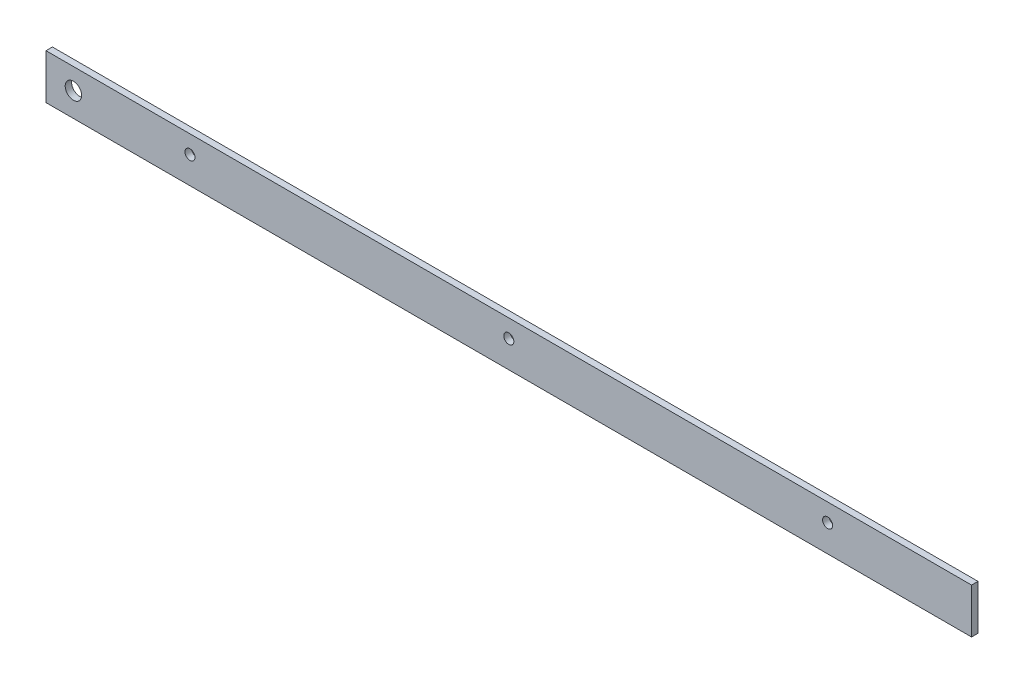
ISO-10303-21;
HEADER;
FILE_DESCRIPTION(('STEP AP214'),'2;1');
FILE_NAME('part.step','',(''),(''),'','','');
FILE_SCHEMA(('AUTOMOTIVE_DESIGN { 1 0 10303 214 1 1 1 1 }'));
ENDSEC;
DATA;
#1=APPLICATION_CONTEXT('core data for automotive mechanical design processes');
#2=APPLICATION_PROTOCOL_DEFINITION('international standard','automotive_design',2000,#1);
#3=PRODUCT_CONTEXT('',#1,'mechanical');
#4=PRODUCT('Part','Part','',(#3));
#5=PRODUCT_RELATED_PRODUCT_CATEGORY('part','',(#4));
#6=PRODUCT_DEFINITION_FORMATION('','',#4);
#7=PRODUCT_DEFINITION_CONTEXT('part definition',#1,'design');
#8=PRODUCT_DEFINITION('design','',#6,#7);
#9=PRODUCT_DEFINITION_SHAPE('','',#8);
#10=(LENGTH_UNIT() NAMED_UNIT(*) SI_UNIT(.MILLI.,.METRE.));
#11=(NAMED_UNIT(*) PLANE_ANGLE_UNIT() SI_UNIT($,.RADIAN.));
#12=(NAMED_UNIT(*) SI_UNIT($,.STERADIAN.) SOLID_ANGLE_UNIT());
#13=UNCERTAINTY_MEASURE_WITH_UNIT(LENGTH_MEASURE(1.E-05),#10,'distance_accuracy_value','');
#14=(GEOMETRIC_REPRESENTATION_CONTEXT(3) GLOBAL_UNCERTAINTY_ASSIGNED_CONTEXT((#13)) GLOBAL_UNIT_ASSIGNED_CONTEXT((#10,
#11,#12)) REPRESENTATION_CONTEXT('',''));
#15=CARTESIAN_POINT('',(0.,0.,0.));
#16=DIRECTION('',(0.,0.,1.));
#17=DIRECTION('',(1.,0.,0.));
#18=AXIS2_PLACEMENT_3D('',#15,#16,#17);
#19=CARTESIAN_POINT('',(-1.23531895766701E-13,17.3919880288977,-3.175));
#20=DIRECTION('',(0.,1.,0.));
#21=DIRECTION('',(-1.,0.,0.));
#22=AXIS2_PLACEMENT_3D('',#19,#20,#21);
#23=PLANE('',#22);
#24=DIRECTION('',(1.,0.,0.));
#25=VECTOR('',#24,1.);
#26=CARTESIAN_POINT('',(-1.23531895766701E-13,17.3919880288977,0.));
#27=LINE('',#26,#25);
#28=CARTESIAN_POINT('',(0.,17.3919880289008,0.));
#29=VERTEX_POINT('',#28);
#30=CARTESIAN_POINT('',(457.2,17.3919880289008,0.));
#31=VERTEX_POINT('',#30);
#32=EDGE_CURVE('E105',#29,#31,#27,.T.);
#33=ORIENTED_EDGE('',*,*,#32,.T.);
#34=DIRECTION('',(0.,0.,-1.));
#35=VECTOR('',#34,1.);
#36=CARTESIAN_POINT('',(457.2,17.3919880289008,0.));
#37=LINE('',#36,#35);
#38=CARTESIAN_POINT('',(457.2,17.3919880289008,-3.175));
#39=VERTEX_POINT('',#38);
#40=EDGE_CURVE('E90',#31,#39,#37,.T.);
#41=ORIENTED_EDGE('',*,*,#40,.T.);
#42=DIRECTION('',(1.,0.,0.));
#43=VECTOR('',#42,1.);
#44=CARTESIAN_POINT('',(-1.23531895766701E-13,17.3919880288977,-3.175));
#45=LINE('',#44,#43);
#46=CARTESIAN_POINT('',(0.,17.3919880289008,-3.175));
#47=VERTEX_POINT('',#46);
#48=EDGE_CURVE('E98',#47,#39,#45,.T.);
#49=ORIENTED_EDGE('',*,*,#48,.F.);
#50=DIRECTION('',(0.,0.,1.));
#51=VECTOR('',#50,1.);
#52=CARTESIAN_POINT('',(0.,17.3919880289008,-3.175));
#53=LINE('',#52,#51);
#54=EDGE_CURVE('E11',#47,#29,#53,.T.);
#55=ORIENTED_EDGE('',*,*,#54,.T.);
#56=EDGE_LOOP('',(#33,#41,#49,#55));
#57=FACE_BOUND('',#56,.T.);
#58=ADVANCED_FACE('F43',(#57),#23,.T.);
#59=CARTESIAN_POINT('',(0.,0.,-3.175));
#60=DIRECTION('',(-1.,0.,0.));
#61=DIRECTION('',(0.,-1.,0.));
#62=AXIS2_PLACEMENT_3D('',#59,#60,#61);
#63=PLANE('',#62);
#64=DIRECTION('',(0.,1.,0.));
#65=VECTOR('',#64,1.);
#66=CARTESIAN_POINT('',(0.,0.,0.));
#67=LINE('',#66,#65);
#68=CARTESIAN_POINT('',(0.,-4.83301197109929,0.));
#69=VERTEX_POINT('',#68);
#70=EDGE_CURVE('E107',#69,#29,#67,.T.);
#71=ORIENTED_EDGE('',*,*,#70,.T.);
#72=ORIENTED_EDGE('',*,*,#54,.F.);
#73=DIRECTION('',(0.,1.,0.));
#74=VECTOR('',#73,1.);
#75=CARTESIAN_POINT('',(0.,0.,-3.175));
#76=LINE('',#75,#74);
#77=CARTESIAN_POINT('',(0.,-4.83301197109929,-3.175));
#78=VERTEX_POINT('',#77);
#79=EDGE_CURVE('E83',#78,#47,#76,.T.);
#80=ORIENTED_EDGE('',*,*,#79,.F.);
#81=DIRECTION('',(0.,0.,1.));
#82=VECTOR('',#81,1.);
#83=CARTESIAN_POINT('',(0.,-4.83301197109929,-3.175));
#84=LINE('',#83,#82);
#85=EDGE_CURVE('E51',#78,#69,#84,.T.);
#86=ORIENTED_EDGE('',*,*,#85,.T.);
#87=EDGE_LOOP('',(#71,#72,#80,#86));
#88=FACE_BOUND('',#87,.T.);
#89=ADVANCED_FACE('F139',(#88),#63,.T.);
#90=CARTESIAN_POINT('',(0.,-4.83301197109929,-3.175));
#91=DIRECTION('',(0.,1.,0.));
#92=DIRECTION('',(0.,0.,-1.));
#93=AXIS2_PLACEMENT_3D('',#90,#91,#92);
#94=PLANE('',#93);
#95=DIRECTION('',(1.,0.,0.));
#96=VECTOR('',#95,1.);
#97=CARTESIAN_POINT('',(0.,-4.83301197109929,0.));
#98=LINE('',#97,#96);
#99=CARTESIAN_POINT('',(457.2,-4.83301197109929,0.));
#100=VERTEX_POINT('',#99);
#101=EDGE_CURVE('E74',#69,#100,#98,.T.);
#102=ORIENTED_EDGE('',*,*,#101,.F.);
#103=ORIENTED_EDGE('',*,*,#85,.F.);
#104=DIRECTION('',(1.,0.,0.));
#105=VECTOR('',#104,1.);
#106=CARTESIAN_POINT('',(0.,-4.83301197109929,-3.175));
#107=LINE('',#106,#105);
#108=CARTESIAN_POINT('',(457.2,-4.83301197109929,-3.175));
#109=VERTEX_POINT('',#108);
#110=EDGE_CURVE('E95',#78,#109,#107,.T.);
#111=ORIENTED_EDGE('',*,*,#110,.T.);
#112=DIRECTION('',(0.,0.,1.));
#113=VECTOR('',#112,1.);
#114=CARTESIAN_POINT('',(457.2,-4.83301197109929,-3.175));
#115=LINE('',#114,#113);
#116=EDGE_CURVE('E92',#109,#100,#115,.T.);
#117=ORIENTED_EDGE('',*,*,#116,.T.);
#118=EDGE_LOOP('',(#102,#103,#111,#117));
#119=FACE_BOUND('',#118,.T.);
#120=ADVANCED_FACE('F169',(#119),#94,.F.);
#121=CARTESIAN_POINT('',(386.08,8.5094880289007,-3.175));
#122=DIRECTION('',(0.,0.,1.));
#123=DIRECTION('',(-1.,0.,0.));
#124=AXIS2_PLACEMENT_3D('',#121,#122,#123);
#125=CYLINDRICAL_SURFACE('',#124,2.48920000000001);
#126=CARTESIAN_POINT('',(386.08,8.5094880289007,-3.175));
#127=DIRECTION('',(0.,0.,1.));
#128=DIRECTION('',(1.,0.,0.));
#129=AXIS2_PLACEMENT_3D('',#126,#127,#128);
#130=CIRCLE('',#129,2.48920000000001);
#131=CARTESIAN_POINT('',(388.5692,8.5094880289007,-3.175));
#132=VERTEX_POINT('',#131);
#133=EDGE_CURVE('E117',#132,#132,#130,.T.);
#134=ORIENTED_EDGE('',*,*,#133,.F.);
#135=EDGE_LOOP('',(#134));
#136=FACE_BOUND('',#135,.T.);
#137=CARTESIAN_POINT('',(386.08,8.5094880289007,0.));
#138=DIRECTION('',(0.,0.,1.));
#139=DIRECTION('',(1.,0.,0.));
#140=AXIS2_PLACEMENT_3D('',#137,#138,#139);
#141=CIRCLE('',#140,2.48920000000001);
#142=CARTESIAN_POINT('',(388.5692,8.5094880289007,0.));
#143=VERTEX_POINT('',#142);
#144=EDGE_CURVE('E132',#143,#143,#141,.T.);
#145=ORIENTED_EDGE('',*,*,#144,.T.);
#146=EDGE_LOOP('',(#145));
#147=FACE_BOUND('',#146,.T.);
#148=ADVANCED_FACE('F173',(#136,#147),#125,.F.);
#149=CARTESIAN_POINT('',(228.6,8.5094880289007,-3.175));
#150=DIRECTION('',(0.,0.,1.));
#151=DIRECTION('',(-1.,0.,0.));
#152=AXIS2_PLACEMENT_3D('',#149,#150,#151);
#153=CYLINDRICAL_SURFACE('',#152,2.4892);
#154=CARTESIAN_POINT('',(228.6,8.5094880289007,-3.175));
#155=DIRECTION('',(0.,0.,1.));
#156=DIRECTION('',(1.,0.,0.));
#157=AXIS2_PLACEMENT_3D('',#154,#155,#156);
#158=CIRCLE('',#157,2.4892);
#159=CARTESIAN_POINT('',(231.0892,8.5094880289007,-3.175));
#160=VERTEX_POINT('',#159);
#161=EDGE_CURVE('E114',#160,#160,#158,.T.);
#162=ORIENTED_EDGE('',*,*,#161,.F.);
#163=EDGE_LOOP('',(#162));
#164=FACE_BOUND('',#163,.T.);
#165=CARTESIAN_POINT('',(228.6,8.5094880289007,0.));
#166=DIRECTION('',(0.,0.,1.));
#167=DIRECTION('',(1.,0.,0.));
#168=AXIS2_PLACEMENT_3D('',#165,#166,#167);
#169=CIRCLE('',#168,2.4892);
#170=CARTESIAN_POINT('',(231.0892,8.5094880289007,0.));
#171=VERTEX_POINT('',#170);
#172=EDGE_CURVE('E129',#171,#171,#169,.T.);
#173=ORIENTED_EDGE('',*,*,#172,.T.);
#174=EDGE_LOOP('',(#173));
#175=FACE_BOUND('',#174,.T.);
#176=ADVANCED_FACE('F178',(#164,#175),#153,.F.);
#177=CARTESIAN_POINT('',(71.12,8.5094880289007,-3.175));
#178=DIRECTION('',(0.,0.,1.));
#179=DIRECTION('',(-1.,0.,0.));
#180=AXIS2_PLACEMENT_3D('',#177,#178,#179);
#181=CYLINDRICAL_SURFACE('',#180,2.4892);
#182=CARTESIAN_POINT('',(71.12,8.5094880289007,-3.175));
#183=DIRECTION('',(0.,0.,1.));
#184=DIRECTION('',(1.,0.,0.));
#185=AXIS2_PLACEMENT_3D('',#182,#183,#184);
#186=CIRCLE('',#185,2.4892);
#187=CARTESIAN_POINT('',(73.6092,8.5094880289007,-3.175));
#188=VERTEX_POINT('',#187);
#189=EDGE_CURVE('E94',#188,#188,#186,.T.);
#190=ORIENTED_EDGE('',*,*,#189,.F.);
#191=EDGE_LOOP('',(#190));
#192=FACE_BOUND('',#191,.T.);
#193=CARTESIAN_POINT('',(71.12,8.5094880289007,0.));
#194=DIRECTION('',(0.,0.,1.));
#195=DIRECTION('',(1.,0.,0.));
#196=AXIS2_PLACEMENT_3D('',#193,#194,#195);
#197=CIRCLE('',#196,2.4892);
#198=CARTESIAN_POINT('',(73.6092,8.5094880289007,0.));
#199=VERTEX_POINT('',#198);
#200=EDGE_CURVE('E126',#199,#199,#197,.T.);
#201=ORIENTED_EDGE('',*,*,#200,.T.);
#202=EDGE_LOOP('',(#201));
#203=FACE_BOUND('',#202,.T.);
#204=ADVANCED_FACE('F162',(#192,#203),#181,.F.);
#205=CARTESIAN_POINT('',(457.2,7.10915919970058E-12,-3.175));
#206=DIRECTION('',(1.,0.,0.));
#207=DIRECTION('',(0.,1.,0.));
#208=AXIS2_PLACEMENT_3D('',#205,#206,#207);
#209=PLANE('',#208);
#210=DIRECTION('',(0.,-1.,0.));
#211=VECTOR('',#210,1.);
#212=CARTESIAN_POINT('',(457.2,7.10915919970058E-12,0.));
#213=LINE('',#212,#211);
#214=EDGE_CURVE('E80',#31,#100,#213,.T.);
#215=ORIENTED_EDGE('',*,*,#214,.T.);
#216=ORIENTED_EDGE('',*,*,#116,.F.);
#217=DIRECTION('',(0.,-1.,0.));
#218=VECTOR('',#217,1.);
#219=CARTESIAN_POINT('',(457.2,7.10915919970058E-12,-3.175));
#220=LINE('',#219,#218);
#221=EDGE_CURVE('E59',#39,#109,#220,.T.);
#222=ORIENTED_EDGE('',*,*,#221,.F.);
#223=ORIENTED_EDGE('',*,*,#40,.F.);
#224=EDGE_LOOP('',(#215,#216,#222,#223));
#225=FACE_BOUND('',#224,.T.);
#226=ADVANCED_FACE('F88',(#225),#209,.T.);
#227=CARTESIAN_POINT('',(13.54,7.02698802890071,-3.175));
#228=DIRECTION('',(0.,0.,1.));
#229=DIRECTION('',(-1.,0.,0.));
#230=AXIS2_PLACEMENT_3D('',#227,#228,#229);
#231=CYLINDRICAL_SURFACE('',#230,4.0635);
#232=CARTESIAN_POINT('',(13.54,7.02698802890071,-3.175));
#233=DIRECTION('',(0.,0.,1.));
#234=DIRECTION('',(1.,0.,0.));
#235=AXIS2_PLACEMENT_3D('',#232,#233,#234);
#236=CIRCLE('',#235,4.0635);
#237=CARTESIAN_POINT('',(17.6035,7.02698802890071,-3.175));
#238=VERTEX_POINT('',#237);
#239=EDGE_CURVE('E120',#238,#238,#236,.F.);
#240=ORIENTED_EDGE('',*,*,#239,.T.);
#241=EDGE_LOOP('',(#240));
#242=FACE_BOUND('',#241,.T.);
#243=CARTESIAN_POINT('',(13.54,7.02698802890071,0.));
#244=DIRECTION('',(0.,0.,1.));
#245=DIRECTION('',(1.,0.,0.));
#246=AXIS2_PLACEMENT_3D('',#243,#244,#245);
#247=CIRCLE('',#246,4.0635);
#248=CARTESIAN_POINT('',(17.6035,7.02698802890071,0.));
#249=VERTEX_POINT('',#248);
#250=EDGE_CURVE('E102',#249,#249,#247,.F.);
#251=ORIENTED_EDGE('',*,*,#250,.F.);
#252=EDGE_LOOP('',(#251));
#253=FACE_BOUND('',#252,.T.);
#254=ADVANCED_FACE('F153',(#242,#253),#231,.F.);
#255=CARTESIAN_POINT('',(0.,0.,-3.175));
#256=DIRECTION('',(0.,0.,-1.));
#257=DIRECTION('',(1.,0.,0.));
#258=AXIS2_PLACEMENT_3D('',#255,#256,#257);
#259=PLANE('',#258);
#260=ORIENTED_EDGE('',*,*,#221,.T.);
#261=ORIENTED_EDGE('',*,*,#110,.F.);
#262=ORIENTED_EDGE('',*,*,#79,.T.);
#263=ORIENTED_EDGE('',*,*,#48,.T.);
#264=EDGE_LOOP('',(#260,#261,#262,#263));
#265=FACE_BOUND('',#264,.T.);
#266=ORIENTED_EDGE('',*,*,#189,.T.);
#267=EDGE_LOOP('',(#266));
#268=FACE_BOUND('',#267,.T.);
#269=ORIENTED_EDGE('',*,*,#161,.T.);
#270=EDGE_LOOP('',(#269));
#271=FACE_BOUND('',#270,.T.);
#272=ORIENTED_EDGE('',*,*,#133,.T.);
#273=EDGE_LOOP('',(#272));
#274=FACE_BOUND('',#273,.T.);
#275=ORIENTED_EDGE('',*,*,#239,.F.);
#276=EDGE_LOOP('',(#275));
#277=FACE_BOUND('',#276,.T.);
#278=ADVANCED_FACE('F99',(#265,#268,#271,#274,#277),#259,.T.);
#279=CARTESIAN_POINT('',(0.,0.,0.));
#280=DIRECTION('',(0.,0.,-1.));
#281=DIRECTION('',(1.,0.,0.));
#282=AXIS2_PLACEMENT_3D('',#279,#280,#281);
#283=PLANE('',#282);
#284=ORIENTED_EDGE('',*,*,#32,.F.);
#285=ORIENTED_EDGE('',*,*,#70,.F.);
#286=ORIENTED_EDGE('',*,*,#101,.T.);
#287=ORIENTED_EDGE('',*,*,#214,.F.);
#288=EDGE_LOOP('',(#284,#285,#286,#287));
#289=FACE_BOUND('',#288,.T.);
#290=ORIENTED_EDGE('',*,*,#200,.F.);
#291=EDGE_LOOP('',(#290));
#292=FACE_BOUND('',#291,.T.);
#293=ORIENTED_EDGE('',*,*,#172,.F.);
#294=EDGE_LOOP('',(#293));
#295=FACE_BOUND('',#294,.T.);
#296=ORIENTED_EDGE('',*,*,#144,.F.);
#297=EDGE_LOOP('',(#296));
#298=FACE_BOUND('',#297,.T.);
#299=ORIENTED_EDGE('',*,*,#250,.T.);
#300=EDGE_LOOP('',(#299));
#301=FACE_BOUND('',#300,.T.);
#302=ADVANCED_FACE('F141',(#289,#292,#295,#298,#301),#283,.F.);
#303=CLOSED_SHELL('',(#58,#89,#120,#148,#176,#204,#226,#254,#278,#302));
#304=MANIFOLD_SOLID_BREP('B2',#303);
#305=ADVANCED_BREP_SHAPE_REPRESENTATION('',(#18,#304),#14);
#306=SHAPE_DEFINITION_REPRESENTATION(#9,#305);
ENDSEC;
END-ISO-10303-21;
